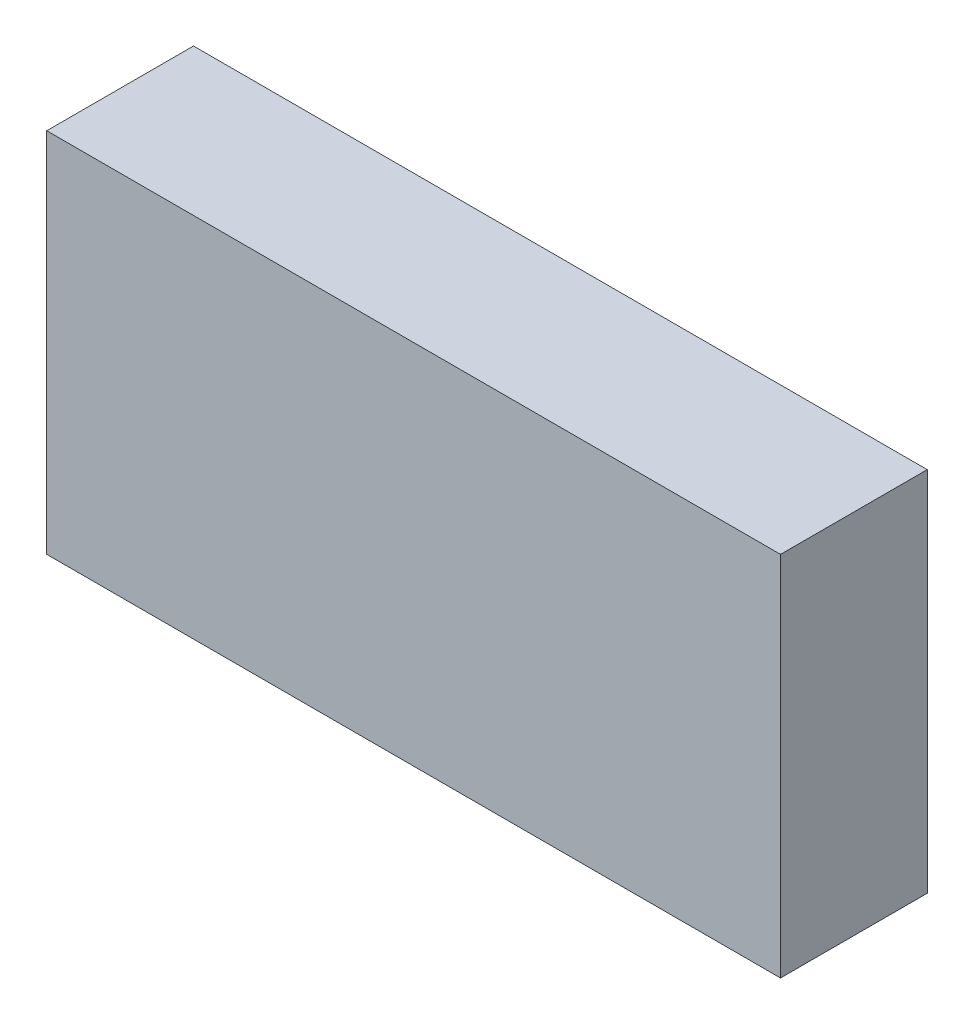
ISO-10303-21;
HEADER;
FILE_DESCRIPTION(('STEP AP214'),'2;1');
FILE_NAME('part.step','',(''),(''),'','','');
FILE_SCHEMA(('AUTOMOTIVE_DESIGN { 1 0 10303 214 1 1 1 1 }'));
ENDSEC;
DATA;
#1=APPLICATION_CONTEXT('core data for automotive mechanical design processes');
#2=APPLICATION_PROTOCOL_DEFINITION('international standard','automotive_design',2000,#1);
#3=PRODUCT_CONTEXT('',#1,'mechanical');
#4=PRODUCT('Part','Part','',(#3));
#5=PRODUCT_RELATED_PRODUCT_CATEGORY('part','',(#4));
#6=PRODUCT_DEFINITION_FORMATION('','',#4);
#7=PRODUCT_DEFINITION_CONTEXT('part definition',#1,'design');
#8=PRODUCT_DEFINITION('design','',#6,#7);
#9=PRODUCT_DEFINITION_SHAPE('','',#8);
#10=(LENGTH_UNIT() NAMED_UNIT(*) SI_UNIT(.MILLI.,.METRE.));
#11=(NAMED_UNIT(*) PLANE_ANGLE_UNIT() SI_UNIT($,.RADIAN.));
#12=(NAMED_UNIT(*) SI_UNIT($,.STERADIAN.) SOLID_ANGLE_UNIT());
#13=UNCERTAINTY_MEASURE_WITH_UNIT(LENGTH_MEASURE(1.E-05),#10,'distance_accuracy_value','');
#14=(GEOMETRIC_REPRESENTATION_CONTEXT(3) GLOBAL_UNCERTAINTY_ASSIGNED_CONTEXT((#13)) GLOBAL_UNIT_ASSIGNED_CONTEXT((#10,
#11,#12)) REPRESENTATION_CONTEXT('',''));
#15=CARTESIAN_POINT('',(0.,0.,0.));
#16=DIRECTION('',(0.,0.,1.));
#17=DIRECTION('',(1.,0.,0.));
#18=AXIS2_PLACEMENT_3D('',#15,#16,#17);
#19=CARTESIAN_POINT('',(-31.6279069767442,18.3139534883721,10.));
#20=DIRECTION('',(1.,0.,0.));
#21=DIRECTION('',(0.,1.,0.));
#22=AXIS2_PLACEMENT_3D('',#19,#20,#21);
#23=PLANE('',#22);
#24=DIRECTION('',(0.,-1.,0.));
#25=VECTOR('',#24,1.);
#26=CARTESIAN_POINT('',(-31.6279069767442,18.3139534883721,0.));
#27=LINE('',#26,#25);
#28=CARTESIAN_POINT('',(-31.6279069767442,18.3139534883721,0.));
#29=VERTEX_POINT('',#28);
#30=CARTESIAN_POINT('',(-31.6279069767442,-6.68604651162791,0.));
#31=VERTEX_POINT('',#30);
#32=EDGE_CURVE('E96',#29,#31,#27,.T.);
#33=ORIENTED_EDGE('',*,*,#32,.T.);
#34=DIRECTION('',(0.,0.,-1.));
#35=VECTOR('',#34,1.);
#36=CARTESIAN_POINT('',(-31.6279069767442,-6.68604651162791,10.));
#37=LINE('',#36,#35);
#38=CARTESIAN_POINT('',(-31.6279069767442,-6.68604651162791,10.));
#39=VERTEX_POINT('',#38);
#40=EDGE_CURVE('E11',#39,#31,#37,.T.);
#41=ORIENTED_EDGE('',*,*,#40,.F.);
#42=DIRECTION('',(0.,-1.,0.));
#43=VECTOR('',#42,1.);
#44=CARTESIAN_POINT('',(-31.6279069767442,18.3139534883721,10.));
#45=LINE('',#44,#43);
#46=CARTESIAN_POINT('',(-31.6279069767442,18.3139534883721,10.));
#47=VERTEX_POINT('',#46);
#48=EDGE_CURVE('E84',#47,#39,#45,.T.);
#49=ORIENTED_EDGE('',*,*,#48,.F.);
#50=DIRECTION('',(0.,0.,-1.));
#51=VECTOR('',#50,1.);
#52=CARTESIAN_POINT('',(-31.6279069767442,18.3139534883721,10.));
#53=LINE('',#52,#51);
#54=EDGE_CURVE('E92',#47,#29,#53,.T.);
#55=ORIENTED_EDGE('',*,*,#54,.T.);
#56=EDGE_LOOP('',(#33,#41,#49,#55));
#57=FACE_BOUND('',#56,.T.);
#58=ADVANCED_FACE('F33',(#57),#23,.F.);
#59=CARTESIAN_POINT('',(-31.6279069767442,-6.68604651162791,10.));
#60=DIRECTION('',(0.,1.,0.));
#61=DIRECTION('',(0.,0.,1.));
#62=AXIS2_PLACEMENT_3D('',#59,#60,#61);
#63=PLANE('',#62);
#64=DIRECTION('',(1.,0.,0.));
#65=VECTOR('',#64,1.);
#66=CARTESIAN_POINT('',(-31.6279069767442,-6.68604651162791,0.));
#67=LINE('',#66,#65);
#68=CARTESIAN_POINT('',(18.3720930232558,-6.68604651162791,0.));
#69=VERTEX_POINT('',#68);
#70=EDGE_CURVE('E88',#31,#69,#67,.T.);
#71=ORIENTED_EDGE('',*,*,#70,.T.);
#72=DIRECTION('',(0.,0.,-1.));
#73=VECTOR('',#72,1.);
#74=CARTESIAN_POINT('',(18.3720930232558,-6.68604651162791,10.));
#75=LINE('',#74,#73);
#76=CARTESIAN_POINT('',(18.3720930232558,-6.68604651162791,10.));
#77=VERTEX_POINT('',#76);
#78=EDGE_CURVE('E41',#77,#69,#75,.T.);
#79=ORIENTED_EDGE('',*,*,#78,.F.);
#80=DIRECTION('',(1.,0.,0.));
#81=VECTOR('',#80,1.);
#82=CARTESIAN_POINT('',(-31.6279069767442,-6.68604651162791,10.));
#83=LINE('',#82,#81);
#84=EDGE_CURVE('E79',#39,#77,#83,.T.);
#85=ORIENTED_EDGE('',*,*,#84,.F.);
#86=ORIENTED_EDGE('',*,*,#40,.T.);
#87=EDGE_LOOP('',(#71,#79,#85,#86));
#88=FACE_BOUND('',#87,.T.);
#89=ADVANCED_FACE('F87',(#88),#63,.F.);
#90=CARTESIAN_POINT('',(18.3720930232558,18.3139534883721,10.));
#91=DIRECTION('',(-1.,0.,0.));
#92=DIRECTION('',(0.,0.,1.));
#93=AXIS2_PLACEMENT_3D('',#90,#91,#92);
#94=PLANE('',#93);
#95=DIRECTION('',(0.,1.,0.));
#96=VECTOR('',#95,1.);
#97=CARTESIAN_POINT('',(18.3720930232558,18.3139534883721,0.));
#98=LINE('',#97,#96);
#99=CARTESIAN_POINT('',(18.3720930232558,18.3139534883721,0.));
#100=VERTEX_POINT('',#99);
#101=EDGE_CURVE('E66',#69,#100,#98,.T.);
#102=ORIENTED_EDGE('',*,*,#101,.T.);
#103=DIRECTION('',(0.,0.,-1.));
#104=VECTOR('',#103,1.);
#105=CARTESIAN_POINT('',(18.3720930232558,18.3139534883721,10.));
#106=LINE('',#105,#104);
#107=CARTESIAN_POINT('',(18.3720930232558,18.3139534883721,10.));
#108=VERTEX_POINT('',#107);
#109=EDGE_CURVE('E89',#108,#100,#106,.T.);
#110=ORIENTED_EDGE('',*,*,#109,.F.);
#111=DIRECTION('',(0.,1.,0.));
#112=VECTOR('',#111,1.);
#113=CARTESIAN_POINT('',(18.3720930232558,18.3139534883721,10.));
#114=LINE('',#113,#112);
#115=EDGE_CURVE('E82',#77,#108,#114,.T.);
#116=ORIENTED_EDGE('',*,*,#115,.F.);
#117=ORIENTED_EDGE('',*,*,#78,.T.);
#118=EDGE_LOOP('',(#102,#110,#116,#117));
#119=FACE_BOUND('',#118,.T.);
#120=ADVANCED_FACE('F90',(#119),#94,.F.);
#121=CARTESIAN_POINT('',(-31.6279069767442,18.3139534883721,10.));
#122=DIRECTION('',(0.,-1.,0.));
#123=DIRECTION('',(0.,0.,-1.));
#124=AXIS2_PLACEMENT_3D('',#121,#122,#123);
#125=PLANE('',#124);
#126=DIRECTION('',(-1.,0.,0.));
#127=VECTOR('',#126,1.);
#128=CARTESIAN_POINT('',(-31.6279069767442,18.3139534883721,0.));
#129=LINE('',#128,#127);
#130=EDGE_CURVE('E72',#100,#29,#129,.T.);
#131=ORIENTED_EDGE('',*,*,#130,.T.);
#132=ORIENTED_EDGE('',*,*,#54,.F.);
#133=DIRECTION('',(-1.,0.,0.));
#134=VECTOR('',#133,1.);
#135=CARTESIAN_POINT('',(-31.6279069767442,18.3139534883721,10.));
#136=LINE('',#135,#134);
#137=EDGE_CURVE('E49',#108,#47,#136,.T.);
#138=ORIENTED_EDGE('',*,*,#137,.F.);
#139=ORIENTED_EDGE('',*,*,#109,.T.);
#140=EDGE_LOOP('',(#131,#132,#138,#139));
#141=FACE_BOUND('',#140,.T.);
#142=ADVANCED_FACE('F103',(#141),#125,.F.);
#143=CARTESIAN_POINT('',(0.,0.,10.));
#144=DIRECTION('',(0.,0.,1.));
#145=DIRECTION('',(1.,0.,0.));
#146=AXIS2_PLACEMENT_3D('',#143,#144,#145);
#147=PLANE('',#146);
#148=ORIENTED_EDGE('',*,*,#48,.T.);
#149=ORIENTED_EDGE('',*,*,#84,.T.);
#150=ORIENTED_EDGE('',*,*,#115,.T.);
#151=ORIENTED_EDGE('',*,*,#137,.T.);
#152=EDGE_LOOP('',(#148,#149,#150,#151));
#153=FACE_BOUND('',#152,.T.);
#154=ADVANCED_FACE('F80',(#153),#147,.T.);
#155=CARTESIAN_POINT('',(0.,0.,0.));
#156=DIRECTION('',(0.,0.,1.));
#157=DIRECTION('',(1.,0.,0.));
#158=AXIS2_PLACEMENT_3D('',#155,#156,#157);
#159=PLANE('',#158);
#160=ORIENTED_EDGE('',*,*,#32,.F.);
#161=ORIENTED_EDGE('',*,*,#130,.F.);
#162=ORIENTED_EDGE('',*,*,#101,.F.);
#163=ORIENTED_EDGE('',*,*,#70,.F.);
#164=EDGE_LOOP('',(#160,#161,#162,#163));
#165=FACE_BOUND('',#164,.T.);
#166=ADVANCED_FACE('F106',(#165),#159,.F.);
#167=CLOSED_SHELL('',(#58,#89,#120,#142,#154,#166));
#168=MANIFOLD_SOLID_BREP('B2',#167);
#169=ADVANCED_BREP_SHAPE_REPRESENTATION('',(#18,#168),#14);
#170=SHAPE_DEFINITION_REPRESENTATION(#9,#169);
ENDSEC;
END-ISO-10303-21;
